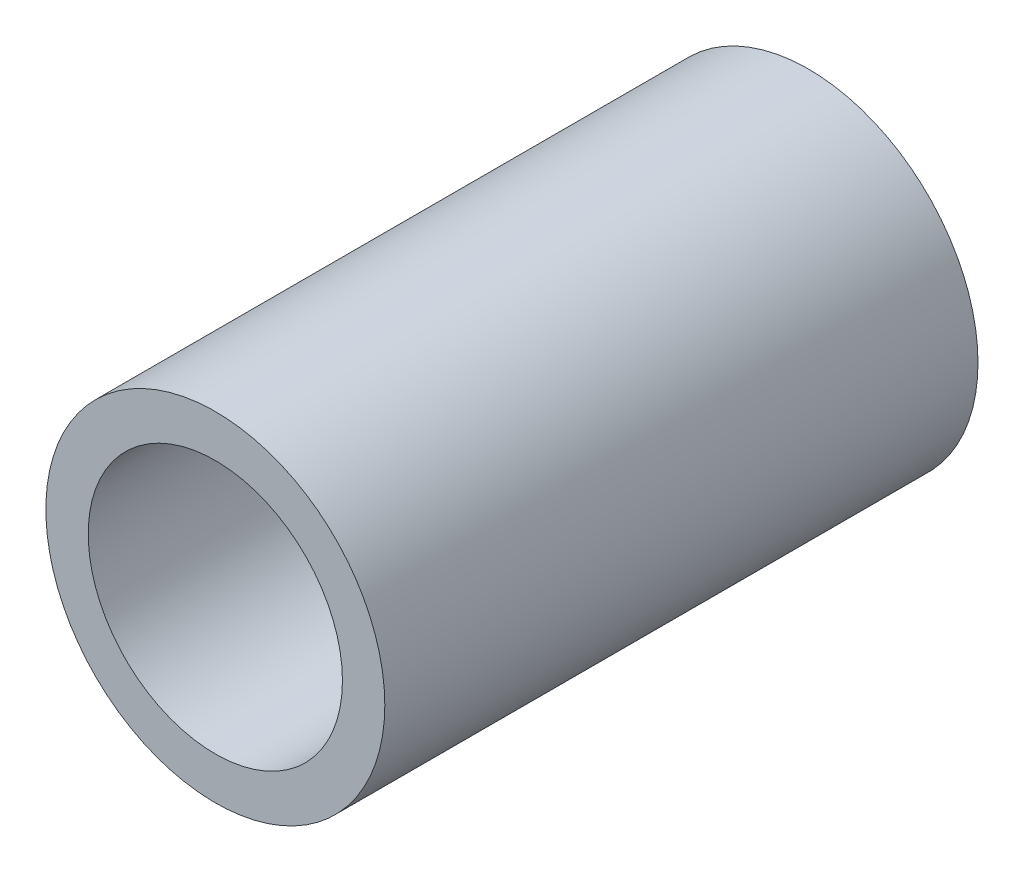
ISO-10303-21;
HEADER;
FILE_DESCRIPTION(('STEP AP214'),'2;1');
FILE_NAME('part.step','',(''),(''),'','','');
FILE_SCHEMA(('AUTOMOTIVE_DESIGN { 1 0 10303 214 1 1 1 1 }'));
ENDSEC;
DATA;
#1=APPLICATION_CONTEXT('core data for automotive mechanical design processes');
#2=APPLICATION_PROTOCOL_DEFINITION('international standard','automotive_design',2000,#1);
#3=PRODUCT_CONTEXT('',#1,'mechanical');
#4=PRODUCT('Part','Part','',(#3));
#5=PRODUCT_RELATED_PRODUCT_CATEGORY('part','',(#4));
#6=PRODUCT_DEFINITION_FORMATION('','',#4);
#7=PRODUCT_DEFINITION_CONTEXT('part definition',#1,'design');
#8=PRODUCT_DEFINITION('design','',#6,#7);
#9=PRODUCT_DEFINITION_SHAPE('','',#8);
#10=(LENGTH_UNIT() NAMED_UNIT(*) SI_UNIT(.MILLI.,.METRE.));
#11=(NAMED_UNIT(*) PLANE_ANGLE_UNIT() SI_UNIT($,.RADIAN.));
#12=(NAMED_UNIT(*) SI_UNIT($,.STERADIAN.) SOLID_ANGLE_UNIT());
#13=UNCERTAINTY_MEASURE_WITH_UNIT(LENGTH_MEASURE(1.E-05),#10,'distance_accuracy_value','');
#14=(GEOMETRIC_REPRESENTATION_CONTEXT(3) GLOBAL_UNCERTAINTY_ASSIGNED_CONTEXT((#13)) GLOBAL_UNIT_ASSIGNED_CONTEXT((#10,
#11,#12)) REPRESENTATION_CONTEXT('',''));
#15=CARTESIAN_POINT('',(0.,0.,0.));
#16=DIRECTION('',(0.,0.,1.));
#17=DIRECTION('',(1.,0.,0.));
#18=AXIS2_PLACEMENT_3D('',#15,#16,#17);
#19=CARTESIAN_POINT('',(0.,0.,22.225));
#20=DIRECTION('',(0.,0.,1.));
#21=DIRECTION('',(1.,0.,0.));
#22=AXIS2_PLACEMENT_3D('',#19,#20,#21);
#23=PLANE('',#22);
#24=CARTESIAN_POINT('',(0.,0.,22.225));
#25=DIRECTION('',(0.,0.,1.));
#26=DIRECTION('',(1.,0.,0.));
#27=AXIS2_PLACEMENT_3D('',#24,#25,#26);
#28=CIRCLE('',#27,6.35);
#29=CARTESIAN_POINT('',(6.35,0.,22.225));
#30=VERTEX_POINT('',#29);
#31=EDGE_CURVE('E10',#30,#30,#28,.T.);
#32=ORIENTED_EDGE('',*,*,#31,.T.);
#33=EDGE_LOOP('',(#32));
#34=FACE_BOUND('',#33,.T.);
#35=CARTESIAN_POINT('',(0.,0.,22.225));
#36=DIRECTION('',(0.,0.,1.));
#37=DIRECTION('',(1.,0.,0.));
#38=AXIS2_PLACEMENT_3D('',#35,#36,#37);
#39=CIRCLE('',#38,4.7625);
#40=CARTESIAN_POINT('',(4.7625,0.,22.225));
#41=VERTEX_POINT('',#40);
#42=EDGE_CURVE('E45',#41,#41,#39,.T.);
#43=ORIENTED_EDGE('',*,*,#42,.F.);
#44=EDGE_LOOP('',(#43));
#45=FACE_BOUND('',#44,.T.);
#46=ADVANCED_FACE('F34',(#34,#45),#23,.T.);
#47=CARTESIAN_POINT('',(0.,0.,0.));
#48=DIRECTION('',(0.,0.,1.));
#49=DIRECTION('',(1.,0.,0.));
#50=AXIS2_PLACEMENT_3D('',#47,#48,#49);
#51=PLANE('',#50);
#52=CARTESIAN_POINT('',(0.,0.,0.));
#53=DIRECTION('',(0.,0.,1.));
#54=DIRECTION('',(1.,0.,0.));
#55=AXIS2_PLACEMENT_3D('',#52,#53,#54);
#56=CIRCLE('',#55,6.35);
#57=CARTESIAN_POINT('',(6.35,0.,0.));
#58=VERTEX_POINT('',#57);
#59=EDGE_CURVE('E38',#58,#58,#56,.T.);
#60=ORIENTED_EDGE('',*,*,#59,.F.);
#61=EDGE_LOOP('',(#60));
#62=FACE_BOUND('',#61,.T.);
#63=CARTESIAN_POINT('',(0.,0.,0.));
#64=DIRECTION('',(0.,0.,1.));
#65=DIRECTION('',(1.,0.,0.));
#66=AXIS2_PLACEMENT_3D('',#63,#64,#65);
#67=CIRCLE('',#66,4.7625);
#68=CARTESIAN_POINT('',(4.7625,0.,0.));
#69=VERTEX_POINT('',#68);
#70=EDGE_CURVE('E47',#69,#69,#67,.T.);
#71=ORIENTED_EDGE('',*,*,#70,.T.);
#72=EDGE_LOOP('',(#71));
#73=FACE_BOUND('',#72,.T.);
#74=ADVANCED_FACE('F57',(#62,#73),#51,.F.);
#75=CARTESIAN_POINT('',(0.,0.,22.225));
#76=DIRECTION('',(0.,0.,-1.));
#77=DIRECTION('',(-1.,0.,0.));
#78=AXIS2_PLACEMENT_3D('',#75,#76,#77);
#79=CYLINDRICAL_SURFACE('',#78,6.35);
#80=ORIENTED_EDGE('',*,*,#31,.F.);
#81=EDGE_LOOP('',(#80));
#82=FACE_BOUND('',#81,.T.);
#83=ORIENTED_EDGE('',*,*,#59,.T.);
#84=EDGE_LOOP('',(#83));
#85=FACE_BOUND('',#84,.T.);
#86=ADVANCED_FACE('F36',(#82,#85),#79,.T.);
#87=CARTESIAN_POINT('',(0.,0.,22.225));
#88=DIRECTION('',(0.,0.,-1.));
#89=DIRECTION('',(-1.,0.,0.));
#90=AXIS2_PLACEMENT_3D('',#87,#88,#89);
#91=CYLINDRICAL_SURFACE('',#90,4.7625);
#92=ORIENTED_EDGE('',*,*,#42,.T.);
#93=EDGE_LOOP('',(#92));
#94=FACE_BOUND('',#93,.T.);
#95=ORIENTED_EDGE('',*,*,#70,.F.);
#96=EDGE_LOOP('',(#95));
#97=FACE_BOUND('',#96,.T.);
#98=ADVANCED_FACE('F53',(#94,#97),#91,.F.);
#99=CLOSED_SHELL('',(#46,#74,#86,#98));
#100=MANIFOLD_SOLID_BREP('B2',#99);
#101=ADVANCED_BREP_SHAPE_REPRESENTATION('',(#18,#100),#14);
#102=SHAPE_DEFINITION_REPRESENTATION(#9,#101);
ENDSEC;
END-ISO-10303-21;
